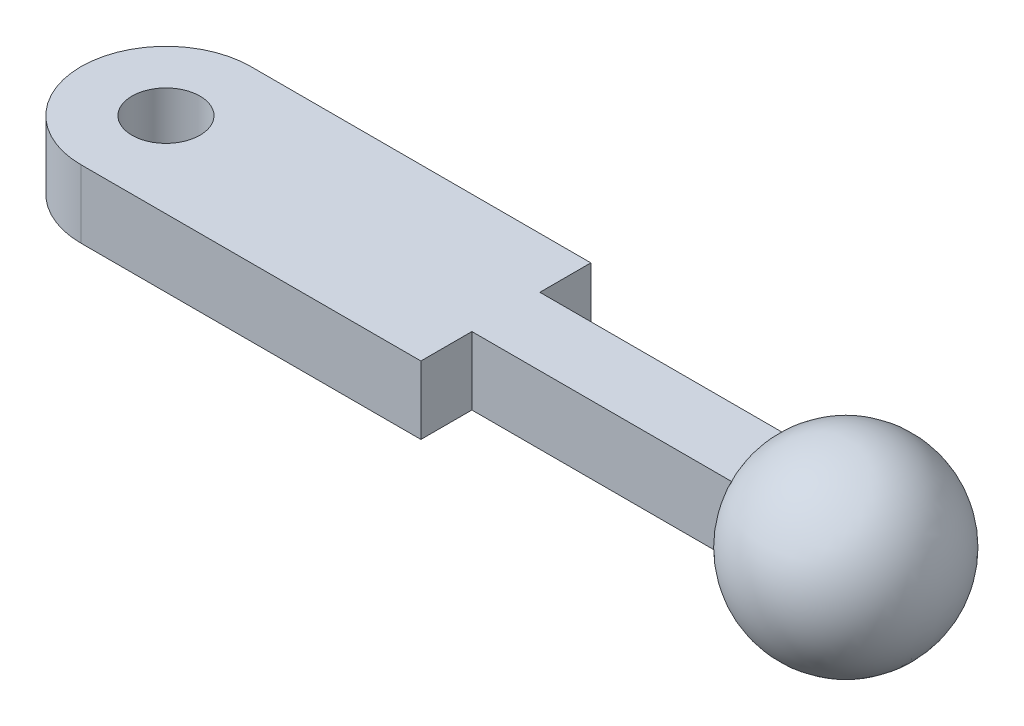
ISO-10303-21;
HEADER;
FILE_DESCRIPTION(('STEP AP214'),'2;1');
FILE_NAME('part.step','',(''),(''),'','','');
FILE_SCHEMA(('AUTOMOTIVE_DESIGN { 1 0 10303 214 1 1 1 1 }'));
ENDSEC;
DATA;
#1=APPLICATION_CONTEXT('core data for automotive mechanical design processes');
#2=APPLICATION_PROTOCOL_DEFINITION('international standard','automotive_design',2000,#1);
#3=PRODUCT_CONTEXT('',#1,'mechanical');
#4=PRODUCT('Part','Part','',(#3));
#5=PRODUCT_RELATED_PRODUCT_CATEGORY('part','',(#4));
#6=PRODUCT_DEFINITION_FORMATION('','',#4);
#7=PRODUCT_DEFINITION_CONTEXT('part definition',#1,'design');
#8=PRODUCT_DEFINITION('design','',#6,#7);
#9=PRODUCT_DEFINITION_SHAPE('','',#8);
#10=(LENGTH_UNIT() NAMED_UNIT(*) SI_UNIT(.MILLI.,.METRE.));
#11=(NAMED_UNIT(*) PLANE_ANGLE_UNIT() SI_UNIT($,.RADIAN.));
#12=(NAMED_UNIT(*) SI_UNIT($,.STERADIAN.) SOLID_ANGLE_UNIT());
#13=UNCERTAINTY_MEASURE_WITH_UNIT(LENGTH_MEASURE(1.E-05),#10,'distance_accuracy_value','');
#14=(GEOMETRIC_REPRESENTATION_CONTEXT(3) GLOBAL_UNCERTAINTY_ASSIGNED_CONTEXT((#13)) GLOBAL_UNIT_ASSIGNED_CONTEXT((#10,
#11,#12)) REPRESENTATION_CONTEXT('',''));
#15=CARTESIAN_POINT('',(0.,0.,0.));
#16=DIRECTION('',(0.,0.,1.));
#17=DIRECTION('',(1.,0.,0.));
#18=AXIS2_PLACEMENT_3D('',#15,#16,#17);
#19=CARTESIAN_POINT('',(10.,1.,0.));
#20=DIRECTION('',(0.,-1.,0.));
#21=DIRECTION('',(-1.,0.,0.));
#22=AXIS2_PLACEMENT_3D('',#19,#20,#21);
#23=SPHERICAL_SURFACE('',#22,2.75);
#24=CARTESIAN_POINT('',(10.,0.,0.));
#25=DIRECTION('',(0.,1.,0.));
#26=DIRECTION('',(0.,0.,1.));
#27=AXIS2_PLACEMENT_3D('',#24,#25,#26);
#28=CIRCLE('',#27,2.5617376914899);
#29=CARTESIAN_POINT('',(7.64150471698585,0.,1.));
#30=VERTEX_POINT('',#29);
#31=CARTESIAN_POINT('',(7.64150471698585,0.,-1.));
#32=VERTEX_POINT('',#31);
#33=EDGE_CURVE('E118',#30,#32,#28,.F.);
#34=ORIENTED_EDGE('',*,*,#33,.T.);
#35=CARTESIAN_POINT('',(10.,1.,-1.));
#36=DIRECTION('',(0.,0.,1.));
#37=DIRECTION('',(0.,-1.,0.));
#38=AXIS2_PLACEMENT_3D('',#35,#36,#37);
#39=CIRCLE('',#38,2.5617376914899);
#40=CARTESIAN_POINT('',(7.64150471698585,2.,-1.));
#41=VERTEX_POINT('',#40);
#42=EDGE_CURVE('E63',#32,#41,#39,.F.);
#43=ORIENTED_EDGE('',*,*,#42,.T.);
#44=CARTESIAN_POINT('',(10.,2.,0.));
#45=DIRECTION('',(0.,1.,0.));
#46=DIRECTION('',(0.,0.,1.));
#47=AXIS2_PLACEMENT_3D('',#44,#45,#46);
#48=CIRCLE('',#47,2.5617376914899);
#49=CARTESIAN_POINT('',(7.64150471698585,2.,1.));
#50=VERTEX_POINT('',#49);
#51=EDGE_CURVE('E56',#50,#41,#48,.F.);
#52=ORIENTED_EDGE('',*,*,#51,.F.);
#53=CARTESIAN_POINT('',(10.,1.,1.));
#54=DIRECTION('',(0.,0.,-1.));
#55=DIRECTION('',(0.,1.,0.));
#56=AXIS2_PLACEMENT_3D('',#53,#54,#55);
#57=CIRCLE('',#56,2.5617376914899);
#58=EDGE_CURVE('E11',#50,#30,#57,.F.);
#59=ORIENTED_EDGE('',*,*,#58,.T.);
#60=EDGE_LOOP('',(#34,#43,#52,#59));
#61=FACE_BOUND('',#60,.T.);
#62=ADVANCED_FACE('F41',(#61),#23,.T.);
#63=CARTESIAN_POINT('',(0.,2.,-2.5));
#64=DIRECTION('',(-1.,0.,0.));
#65=DIRECTION('',(0.,0.,1.));
#66=AXIS2_PLACEMENT_3D('',#63,#64,#65);
#67=PLANE('',#66);
#68=DIRECTION('',(0.,1.,0.));
#69=VECTOR('',#68,1.);
#70=CARTESIAN_POINT('',(0.,2.,-1.));
#71=LINE('',#70,#69);
#72=CARTESIAN_POINT('',(0.,0.,-1.));
#73=VERTEX_POINT('',#72);
#74=CARTESIAN_POINT('',(0.,2.,-1.));
#75=VERTEX_POINT('',#74);
#76=EDGE_CURVE('E125',#73,#75,#71,.T.);
#77=ORIENTED_EDGE('',*,*,#76,.F.);
#78=DIRECTION('',(0.,0.,-1.));
#79=VECTOR('',#78,1.);
#80=CARTESIAN_POINT('',(0.,0.,-2.5));
#81=LINE('',#80,#79);
#82=CARTESIAN_POINT('',(0.,0.,-2.5));
#83=VERTEX_POINT('',#82);
#84=EDGE_CURVE('E159',#73,#83,#81,.T.);
#85=ORIENTED_EDGE('',*,*,#84,.T.);
#86=DIRECTION('',(0.,-1.,0.));
#87=VECTOR('',#86,1.);
#88=CARTESIAN_POINT('',(0.,2.,-2.5));
#89=LINE('',#88,#87);
#90=CARTESIAN_POINT('',(0.,2.,-2.5));
#91=VERTEX_POINT('',#90);
#92=EDGE_CURVE('E165',#91,#83,#89,.T.);
#93=ORIENTED_EDGE('',*,*,#92,.F.);
#94=DIRECTION('',(0.,0.,-1.));
#95=VECTOR('',#94,1.);
#96=CARTESIAN_POINT('',(0.,2.,-2.5));
#97=LINE('',#96,#95);
#98=EDGE_CURVE('E148',#75,#91,#97,.T.);
#99=ORIENTED_EDGE('',*,*,#98,.F.);
#100=EDGE_LOOP('',(#77,#85,#93,#99));
#101=FACE_BOUND('',#100,.T.);
#102=ADVANCED_FACE('F192',(#101),#67,.F.);
#103=DIRECTION('',(0.,-1.,0.));
#104=VECTOR('',#103,1.);
#105=CARTESIAN_POINT('',(0.,2.,1.));
#106=LINE('',#105,#104);
#107=CARTESIAN_POINT('',(0.,2.,1.));
#108=VERTEX_POINT('',#107);
#109=CARTESIAN_POINT('',(0.,0.,1.));
#110=VERTEX_POINT('',#109);
#111=EDGE_CURVE('E110',#108,#110,#106,.T.);
#112=ORIENTED_EDGE('',*,*,#111,.F.);
#113=CARTESIAN_POINT('',(0.,2.,2.5));
#114=VERTEX_POINT('',#113);
#115=EDGE_CURVE('E149',#114,#108,#97,.T.);
#116=ORIENTED_EDGE('',*,*,#115,.F.);
#117=DIRECTION('',(0.,-1.,0.));
#118=VECTOR('',#117,1.);
#119=CARTESIAN_POINT('',(0.,2.,2.5));
#120=LINE('',#119,#118);
#121=CARTESIAN_POINT('',(0.,0.,2.5));
#122=VERTEX_POINT('',#121);
#123=EDGE_CURVE('E168',#114,#122,#120,.T.);
#124=ORIENTED_EDGE('',*,*,#123,.T.);
#125=EDGE_CURVE('E160',#122,#110,#81,.T.);
#126=ORIENTED_EDGE('',*,*,#125,.T.);
#127=EDGE_LOOP('',(#112,#116,#124,#126));
#128=FACE_BOUND('',#127,.T.);
#129=ADVANCED_FACE('F181',(#128),#67,.F.);
#130=CARTESIAN_POINT('',(-10.,2.,0.));
#131=DIRECTION('',(0.,1.,0.));
#132=DIRECTION('',(0.,0.,1.));
#133=AXIS2_PLACEMENT_3D('',#130,#131,#132);
#134=PLANE('',#133);
#135=DIRECTION('',(-1.,0.,0.));
#136=VECTOR('',#135,1.);
#137=CARTESIAN_POINT('',(11.,2.,1.));
#138=LINE('',#137,#136);
#139=EDGE_CURVE('E114',#50,#108,#138,.T.);
#140=ORIENTED_EDGE('',*,*,#139,.F.);
#141=ORIENTED_EDGE('',*,*,#51,.T.);
#142=DIRECTION('',(-1.,0.,0.));
#143=VECTOR('',#142,1.);
#144=CARTESIAN_POINT('',(11.,2.,-1.));
#145=LINE('',#144,#143);
#146=EDGE_CURVE('E133',#41,#75,#145,.T.);
#147=ORIENTED_EDGE('',*,*,#146,.T.);
#148=ORIENTED_EDGE('',*,*,#98,.T.);
#149=DIRECTION('',(-1.,0.,0.));
#150=VECTOR('',#149,1.);
#151=CARTESIAN_POINT('',(-10.,2.,-2.5));
#152=LINE('',#151,#150);
#153=CARTESIAN_POINT('',(-10.,2.,-2.5));
#154=VERTEX_POINT('',#153);
#155=EDGE_CURVE('E152',#91,#154,#152,.T.);
#156=ORIENTED_EDGE('',*,*,#155,.T.);
#157=CARTESIAN_POINT('',(-10.,2.,0.));
#158=DIRECTION('',(0.,1.,0.));
#159=DIRECTION('',(0.,0.,1.));
#160=AXIS2_PLACEMENT_3D('',#157,#158,#159);
#161=CIRCLE('',#160,2.5);
#162=CARTESIAN_POINT('',(-10.,2.,2.5));
#163=VERTEX_POINT('',#162);
#164=EDGE_CURVE('E142',#154,#163,#161,.T.);
#165=ORIENTED_EDGE('',*,*,#164,.T.);
#166=DIRECTION('',(1.,0.,0.));
#167=VECTOR('',#166,1.);
#168=CARTESIAN_POINT('',(-10.,2.,2.5));
#169=LINE('',#168,#167);
#170=EDGE_CURVE('E145',#163,#114,#169,.T.);
#171=ORIENTED_EDGE('',*,*,#170,.T.);
#172=ORIENTED_EDGE('',*,*,#115,.T.);
#173=EDGE_LOOP('',(#140,#141,#147,#148,#156,#165,#171,#172));
#174=FACE_BOUND('',#173,.T.);
#175=CARTESIAN_POINT('',(-10.,2.,0.));
#176=DIRECTION('',(0.,1.,0.));
#177=DIRECTION('',(0.,0.,1.));
#178=AXIS2_PLACEMENT_3D('',#175,#176,#177);
#179=CIRCLE('',#178,1.);
#180=CARTESIAN_POINT('',(-10.,2.,1.));
#181=VERTEX_POINT('',#180);
#182=EDGE_CURVE('E136',#181,#181,#179,.T.);
#183=ORIENTED_EDGE('',*,*,#182,.F.);
#184=EDGE_LOOP('',(#183));
#185=FACE_BOUND('',#184,.T.);
#186=ADVANCED_FACE('F183',(#174,#185),#134,.T.);
#187=CARTESIAN_POINT('',(-10.,0.,0.));
#188=DIRECTION('',(0.,1.,0.));
#189=DIRECTION('',(0.,0.,1.));
#190=AXIS2_PLACEMENT_3D('',#187,#188,#189);
#191=PLANE('',#190);
#192=ORIENTED_EDGE('',*,*,#33,.F.);
#193=DIRECTION('',(-1.,0.,0.));
#194=VECTOR('',#193,1.);
#195=CARTESIAN_POINT('',(11.,0.,1.));
#196=LINE('',#195,#194);
#197=EDGE_CURVE('E106',#30,#110,#196,.T.);
#198=ORIENTED_EDGE('',*,*,#197,.T.);
#199=ORIENTED_EDGE('',*,*,#125,.F.);
#200=DIRECTION('',(1.,0.,0.));
#201=VECTOR('',#200,1.);
#202=CARTESIAN_POINT('',(-10.,0.,2.5));
#203=LINE('',#202,#201);
#204=CARTESIAN_POINT('',(-10.,0.,2.5));
#205=VERTEX_POINT('',#204);
#206=EDGE_CURVE('E157',#205,#122,#203,.T.);
#207=ORIENTED_EDGE('',*,*,#206,.F.);
#208=CARTESIAN_POINT('',(-10.,0.,0.));
#209=DIRECTION('',(0.,1.,0.));
#210=DIRECTION('',(0.,0.,1.));
#211=AXIS2_PLACEMENT_3D('',#208,#209,#210);
#212=CIRCLE('',#211,2.5);
#213=CARTESIAN_POINT('',(-10.,0.,-2.5));
#214=VERTEX_POINT('',#213);
#215=EDGE_CURVE('E139',#214,#205,#212,.T.);
#216=ORIENTED_EDGE('',*,*,#215,.F.);
#217=DIRECTION('',(-1.,0.,0.));
#218=VECTOR('',#217,1.);
#219=CARTESIAN_POINT('',(-10.,0.,-2.5));
#220=LINE('',#219,#218);
#221=EDGE_CURVE('E146',#83,#214,#220,.T.);
#222=ORIENTED_EDGE('',*,*,#221,.F.);
#223=ORIENTED_EDGE('',*,*,#84,.F.);
#224=DIRECTION('',(-1.,0.,0.));
#225=VECTOR('',#224,1.);
#226=CARTESIAN_POINT('',(11.,0.,-1.));
#227=LINE('',#226,#225);
#228=EDGE_CURVE('E115',#32,#73,#227,.T.);
#229=ORIENTED_EDGE('',*,*,#228,.F.);
#230=EDGE_LOOP('',(#192,#198,#199,#207,#216,#222,#223,#229));
#231=FACE_BOUND('',#230,.T.);
#232=CARTESIAN_POINT('',(-10.,0.,0.));
#233=DIRECTION('',(0.,1.,0.));
#234=DIRECTION('',(0.,0.,1.));
#235=AXIS2_PLACEMENT_3D('',#232,#233,#234);
#236=CIRCLE('',#235,1.);
#237=CARTESIAN_POINT('',(-10.,0.,1.));
#238=VERTEX_POINT('',#237);
#239=EDGE_CURVE('E135',#238,#238,#236,.T.);
#240=ORIENTED_EDGE('',*,*,#239,.T.);
#241=EDGE_LOOP('',(#240));
#242=FACE_BOUND('',#241,.T.);
#243=ADVANCED_FACE('F119',(#231,#242),#191,.F.);
#244=CARTESIAN_POINT('',(-10.,2.,0.));
#245=DIRECTION('',(0.,-1.,0.));
#246=DIRECTION('',(0.,0.,-1.));
#247=AXIS2_PLACEMENT_3D('',#244,#245,#246);
#248=CYLINDRICAL_SURFACE('',#247,2.5);
#249=ORIENTED_EDGE('',*,*,#215,.T.);
#250=DIRECTION('',(0.,-1.,0.));
#251=VECTOR('',#250,1.);
#252=CARTESIAN_POINT('',(-10.,2.,2.5));
#253=LINE('',#252,#251);
#254=EDGE_CURVE('E49',#163,#205,#253,.T.);
#255=ORIENTED_EDGE('',*,*,#254,.F.);
#256=ORIENTED_EDGE('',*,*,#164,.F.);
#257=DIRECTION('',(0.,-1.,0.));
#258=VECTOR('',#257,1.);
#259=CARTESIAN_POINT('',(-10.,2.,-2.5));
#260=LINE('',#259,#258);
#261=EDGE_CURVE('E154',#154,#214,#260,.T.);
#262=ORIENTED_EDGE('',*,*,#261,.T.);
#263=EDGE_LOOP('',(#249,#255,#256,#262));
#264=FACE_BOUND('',#263,.T.);
#265=ADVANCED_FACE('F43',(#264),#248,.T.);
#266=CARTESIAN_POINT('',(-10.,2.,2.5));
#267=DIRECTION('',(0.,0.,-1.));
#268=DIRECTION('',(-1.,0.,0.));
#269=AXIS2_PLACEMENT_3D('',#266,#267,#268);
#270=PLANE('',#269);
#271=ORIENTED_EDGE('',*,*,#206,.T.);
#272=ORIENTED_EDGE('',*,*,#123,.F.);
#273=ORIENTED_EDGE('',*,*,#170,.F.);
#274=ORIENTED_EDGE('',*,*,#254,.T.);
#275=EDGE_LOOP('',(#271,#272,#273,#274));
#276=FACE_BOUND('',#275,.T.);
#277=ADVANCED_FACE('F173',(#276),#270,.F.);
#278=CARTESIAN_POINT('',(-10.,2.,-2.5));
#279=DIRECTION('',(0.,0.,1.));
#280=DIRECTION('',(1.,0.,0.));
#281=AXIS2_PLACEMENT_3D('',#278,#279,#280);
#282=PLANE('',#281);
#283=ORIENTED_EDGE('',*,*,#221,.T.);
#284=ORIENTED_EDGE('',*,*,#261,.F.);
#285=ORIENTED_EDGE('',*,*,#155,.F.);
#286=ORIENTED_EDGE('',*,*,#92,.T.);
#287=EDGE_LOOP('',(#283,#284,#285,#286));
#288=FACE_BOUND('',#287,.T.);
#289=ADVANCED_FACE('F189',(#288),#282,.F.);
#290=CARTESIAN_POINT('',(-10.,2.,0.));
#291=DIRECTION('',(0.,-1.,0.));
#292=DIRECTION('',(0.,0.,-1.));
#293=AXIS2_PLACEMENT_3D('',#290,#291,#292);
#294=CYLINDRICAL_SURFACE('',#293,1.);
#295=ORIENTED_EDGE('',*,*,#182,.T.);
#296=EDGE_LOOP('',(#295));
#297=FACE_BOUND('',#296,.T.);
#298=ORIENTED_EDGE('',*,*,#239,.F.);
#299=EDGE_LOOP('',(#298));
#300=FACE_BOUND('',#299,.T.);
#301=ADVANCED_FACE('F195',(#297,#300),#294,.F.);
#302=CARTESIAN_POINT('',(11.,2.,-1.));
#303=DIRECTION('',(0.,0.,1.));
#304=DIRECTION('',(0.,-1.,0.));
#305=AXIS2_PLACEMENT_3D('',#302,#303,#304);
#306=PLANE('',#305);
#307=ORIENTED_EDGE('',*,*,#42,.F.);
#308=ORIENTED_EDGE('',*,*,#228,.T.);
#309=ORIENTED_EDGE('',*,*,#76,.T.);
#310=ORIENTED_EDGE('',*,*,#146,.F.);
#311=EDGE_LOOP('',(#307,#308,#309,#310));
#312=FACE_BOUND('',#311,.T.);
#313=ADVANCED_FACE('F193',(#312),#306,.F.);
#314=CARTESIAN_POINT('',(11.,2.,1.));
#315=DIRECTION('',(0.,0.,-1.));
#316=DIRECTION('',(0.,1.,0.));
#317=AXIS2_PLACEMENT_3D('',#314,#315,#316);
#318=PLANE('',#317);
#319=ORIENTED_EDGE('',*,*,#58,.F.);
#320=ORIENTED_EDGE('',*,*,#139,.T.);
#321=ORIENTED_EDGE('',*,*,#111,.T.);
#322=ORIENTED_EDGE('',*,*,#197,.F.);
#323=EDGE_LOOP('',(#319,#320,#321,#322));
#324=FACE_BOUND('',#323,.T.);
#325=ADVANCED_FACE('F108',(#324),#318,.F.);
#326=CLOSED_SHELL('',(#62,#102,#129,#186,#243,#265,#277,#289,#301,#313,#325));
#327=MANIFOLD_SOLID_BREP('B2',#326);
#328=ADVANCED_BREP_SHAPE_REPRESENTATION('',(#18,#327),#14);
#329=SHAPE_DEFINITION_REPRESENTATION(#9,#328);
ENDSEC;
END-ISO-10303-21;
